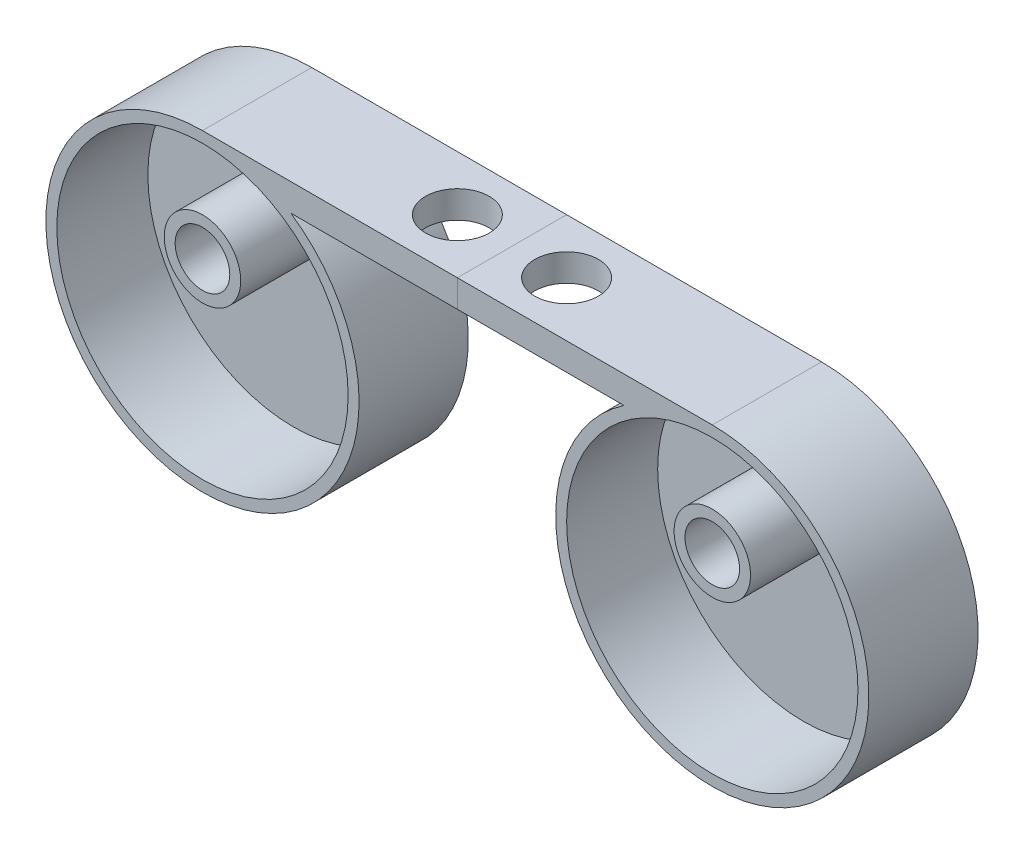
ISO-10303-21;
HEADER;
FILE_DESCRIPTION(('STEP AP214'),'2;1');
FILE_NAME('part.step','',(''),(''),'','','');
FILE_SCHEMA(('AUTOMOTIVE_DESIGN { 1 0 10303 214 1 1 1 1 }'));
ENDSEC;
DATA;
#1=APPLICATION_CONTEXT('core data for automotive mechanical design processes');
#2=APPLICATION_PROTOCOL_DEFINITION('international standard','automotive_design',2000,#1);
#3=PRODUCT_CONTEXT('',#1,'mechanical');
#4=PRODUCT('Part','Part','',(#3));
#5=PRODUCT_RELATED_PRODUCT_CATEGORY('part','',(#4));
#6=PRODUCT_DEFINITION_FORMATION('','',#4);
#7=PRODUCT_DEFINITION_CONTEXT('part definition',#1,'design');
#8=PRODUCT_DEFINITION('design','',#6,#7);
#9=PRODUCT_DEFINITION_SHAPE('','',#8);
#10=(LENGTH_UNIT() NAMED_UNIT(*) SI_UNIT(.MILLI.,.METRE.));
#11=(NAMED_UNIT(*) PLANE_ANGLE_UNIT() SI_UNIT($,.RADIAN.));
#12=(NAMED_UNIT(*) SI_UNIT($,.STERADIAN.) SOLID_ANGLE_UNIT());
#13=UNCERTAINTY_MEASURE_WITH_UNIT(LENGTH_MEASURE(1.E-05),#10,'distance_accuracy_value','');
#14=(GEOMETRIC_REPRESENTATION_CONTEXT(3) GLOBAL_UNCERTAINTY_ASSIGNED_CONTEXT((#13)) GLOBAL_UNIT_ASSIGNED_CONTEXT((#10,
#11,#12)) REPRESENTATION_CONTEXT('',''));
#15=CARTESIAN_POINT('',(0.,0.,0.));
#16=DIRECTION('',(0.,0.,1.));
#17=DIRECTION('',(1.,0.,0.));
#18=AXIS2_PLACEMENT_3D('',#15,#16,#17);
#19=CARTESIAN_POINT('',(56.,0.,2.));
#20=DIRECTION('',(0.,0.,1.));
#21=DIRECTION('',(-1.,0.,0.));
#22=AXIS2_PLACEMENT_3D('',#19,#20,#21);
#23=PLANE('',#22);
#24=CARTESIAN_POINT('',(56.,0.,2.));
#25=DIRECTION('',(0.,0.,-1.));
#26=DIRECTION('',(-1.,0.,0.));
#27=AXIS2_PLACEMENT_3D('',#24,#25,#26);
#28=CIRCLE('',#27,16.);
#29=CARTESIAN_POINT('',(40.,0.,2.));
#30=VERTEX_POINT('',#29);
#31=EDGE_CURVE('E13',#30,#30,#28,.F.);
#32=ORIENTED_EDGE('',*,*,#31,.T.);
#33=EDGE_LOOP('',(#32));
#34=FACE_BOUND('',#33,.T.);
#35=CARTESIAN_POINT('',(56.,5.,2.));
#36=DIRECTION('',(0.,0.,-1.));
#37=DIRECTION('',(-1.,0.,0.));
#38=AXIS2_PLACEMENT_3D('',#35,#36,#37);
#39=CIRCLE('',#38,4.2);
#40=CARTESIAN_POINT('',(51.8,5.,2.));
#41=VERTEX_POINT('',#40);
#42=EDGE_CURVE('E134',#41,#41,#39,.T.);
#43=ORIENTED_EDGE('',*,*,#42,.T.);
#44=EDGE_LOOP('',(#43));
#45=FACE_BOUND('',#44,.T.);
#46=ADVANCED_FACE('F52',(#34,#45),#23,.T.);
#47=CARTESIAN_POINT('',(56.,0.,0.));
#48=DIRECTION('',(0.,0.,1.));
#49=DIRECTION('',(-1.,0.,0.));
#50=AXIS2_PLACEMENT_3D('',#47,#48,#49);
#51=PLANE('',#50);
#52=CARTESIAN_POINT('',(56.,0.,0.));
#53=DIRECTION('',(0.,0.,-1.));
#54=DIRECTION('',(-1.,0.,0.));
#55=AXIS2_PLACEMENT_3D('',#52,#53,#54);
#56=CIRCLE('',#55,17.2);
#57=CARTESIAN_POINT('',(56.,17.2,0.));
#58=VERTEX_POINT('',#57);
#59=CARTESIAN_POINT('',(46.2943315531592,14.2,0.));
#60=VERTEX_POINT('',#59);
#61=EDGE_CURVE('E60',#58,#60,#56,.T.);
#62=ORIENTED_EDGE('',*,*,#61,.T.);
#63=DIRECTION('',(-1.,0.,0.));
#64=VECTOR('',#63,1.);
#65=CARTESIAN_POINT('',(73.201,14.2,0.));
#66=LINE('',#65,#64);
#67=CARTESIAN_POINT('',(28.,14.2,0.));
#68=VERTEX_POINT('',#67);
#69=EDGE_CURVE('E110',#60,#68,#66,.T.);
#70=ORIENTED_EDGE('',*,*,#69,.T.);
#71=DIRECTION('',(0.,1.,0.));
#72=VECTOR('',#71,1.);
#73=CARTESIAN_POINT('',(28.,17.2,0.));
#74=LINE('',#73,#72);
#75=CARTESIAN_POINT('',(28.,17.2,0.));
#76=VERTEX_POINT('',#75);
#77=EDGE_CURVE('E99',#68,#76,#74,.T.);
#78=ORIENTED_EDGE('',*,*,#77,.T.);
#79=DIRECTION('',(-1.,0.,0.));
#80=VECTOR('',#79,1.);
#81=CARTESIAN_POINT('',(73.201,17.2,0.));
#82=LINE('',#81,#80);
#83=EDGE_CURVE('E125',#58,#76,#82,.T.);
#84=ORIENTED_EDGE('',*,*,#83,.F.);
#85=EDGE_LOOP('',(#62,#70,#78,#84));
#86=FACE_BOUND('',#85,.T.);
#87=CARTESIAN_POINT('',(56.,5.,0.));
#88=DIRECTION('',(0.,0.,-1.));
#89=DIRECTION('',(-1.,0.,0.));
#90=AXIS2_PLACEMENT_3D('',#87,#88,#89);
#91=CIRCLE('',#90,3.);
#92=CARTESIAN_POINT('',(53.,5.,0.));
#93=VERTEX_POINT('',#92);
#94=EDGE_CURVE('E141',#93,#93,#91,.T.);
#95=ORIENTED_EDGE('',*,*,#94,.F.);
#96=EDGE_LOOP('',(#95));
#97=FACE_BOUND('',#96,.T.);
#98=ADVANCED_FACE('F148',(#86,#97),#51,.F.);
#99=CARTESIAN_POINT('',(56.,0.,2.));
#100=DIRECTION('',(0.,0.,-1.));
#101=DIRECTION('',(1.,0.,0.));
#102=AXIS2_PLACEMENT_3D('',#99,#100,#101);
#103=CYLINDRICAL_SURFACE('',#102,17.2);
#104=ORIENTED_EDGE('',*,*,#61,.F.);
#105=DIRECTION('',(0.,0.,-1.));
#106=VECTOR('',#105,1.);
#107=CARTESIAN_POINT('',(56.,17.2,2.));
#108=LINE('',#107,#106);
#109=CARTESIAN_POINT('',(56.,17.2,12.));
#110=VERTEX_POINT('',#109);
#111=EDGE_CURVE('E72',#58,#110,#108,.F.);
#112=ORIENTED_EDGE('',*,*,#111,.T.);
#113=CARTESIAN_POINT('',(56.,0.,12.));
#114=DIRECTION('',(0.,0.,-1.));
#115=DIRECTION('',(-1.,0.,0.));
#116=AXIS2_PLACEMENT_3D('',#113,#114,#115);
#117=CIRCLE('',#116,17.2);
#118=CARTESIAN_POINT('',(46.2943315531593,14.2,12.));
#119=VERTEX_POINT('',#118);
#120=EDGE_CURVE('E132',#110,#119,#117,.T.);
#121=ORIENTED_EDGE('',*,*,#120,.T.);
#122=DIRECTION('',(0.,0.,-1.));
#123=VECTOR('',#122,1.);
#124=CARTESIAN_POINT('',(46.2943315531593,14.2,2.));
#125=LINE('',#124,#123);
#126=EDGE_CURVE('E107',#119,#60,#125,.T.);
#127=ORIENTED_EDGE('',*,*,#126,.T.);
#128=EDGE_LOOP('',(#104,#112,#121,#127));
#129=FACE_BOUND('',#128,.T.);
#130=ADVANCED_FACE('F54',(#129),#103,.T.);
#131=CARTESIAN_POINT('',(56.,5.,2.));
#132=DIRECTION('',(0.,0.,-1.));
#133=DIRECTION('',(1.,0.,0.));
#134=AXIS2_PLACEMENT_3D('',#131,#132,#133);
#135=CYLINDRICAL_SURFACE('',#134,3.);
#136=ORIENTED_EDGE('',*,*,#94,.T.);
#137=EDGE_LOOP('',(#136));
#138=FACE_BOUND('',#137,.T.);
#139=CARTESIAN_POINT('',(56.,5.,12.));
#140=DIRECTION('',(0.,0.,-1.));
#141=DIRECTION('',(-1.,0.,0.));
#142=AXIS2_PLACEMENT_3D('',#139,#140,#141);
#143=CIRCLE('',#142,3.);
#144=CARTESIAN_POINT('',(53.,5.,12.));
#145=VERTEX_POINT('',#144);
#146=EDGE_CURVE('E135',#145,#145,#143,.F.);
#147=ORIENTED_EDGE('',*,*,#146,.T.);
#148=EDGE_LOOP('',(#147));
#149=FACE_BOUND('',#148,.T.);
#150=ADVANCED_FACE('F152',(#138,#149),#135,.F.);
#151=CARTESIAN_POINT('',(56.,5.,12.));
#152=DIRECTION('',(0.,0.,-1.));
#153=DIRECTION('',(1.,0.,0.));
#154=AXIS2_PLACEMENT_3D('',#151,#152,#153);
#155=CYLINDRICAL_SURFACE('',#154,4.2);
#156=CARTESIAN_POINT('',(56.,5.,12.));
#157=DIRECTION('',(0.,0.,-1.));
#158=DIRECTION('',(-1.,0.,0.));
#159=AXIS2_PLACEMENT_3D('',#156,#157,#158);
#160=CIRCLE('',#159,4.2);
#161=CARTESIAN_POINT('',(51.8,5.,12.));
#162=VERTEX_POINT('',#161);
#163=EDGE_CURVE('E138',#162,#162,#160,.T.);
#164=ORIENTED_EDGE('',*,*,#163,.T.);
#165=EDGE_LOOP('',(#164));
#166=FACE_BOUND('',#165,.T.);
#167=ORIENTED_EDGE('',*,*,#42,.F.);
#168=EDGE_LOOP('',(#167));
#169=FACE_BOUND('',#168,.T.);
#170=ADVANCED_FACE('F157',(#166,#169),#155,.T.);
#171=CARTESIAN_POINT('',(56.,0.,12.));
#172=DIRECTION('',(0.,0.,1.));
#173=DIRECTION('',(-1.,0.,0.));
#174=AXIS2_PLACEMENT_3D('',#171,#172,#173);
#175=PLANE('',#174);
#176=ORIENTED_EDGE('',*,*,#146,.F.);
#177=EDGE_LOOP('',(#176));
#178=FACE_BOUND('',#177,.T.);
#179=ORIENTED_EDGE('',*,*,#163,.F.);
#180=EDGE_LOOP('',(#179));
#181=FACE_BOUND('',#180,.T.);
#182=ADVANCED_FACE('F169',(#178,#181),#175,.T.);
#183=CARTESIAN_POINT('',(56.,0.,12.));
#184=DIRECTION('',(0.,0.,-1.));
#185=DIRECTION('',(1.,0.,0.));
#186=AXIS2_PLACEMENT_3D('',#183,#184,#185);
#187=CYLINDRICAL_SURFACE('',#186,16.);
#188=CARTESIAN_POINT('',(56.,0.,12.));
#189=DIRECTION('',(0.,0.,-1.));
#190=DIRECTION('',(-1.,0.,0.));
#191=AXIS2_PLACEMENT_3D('',#188,#189,#190);
#192=CIRCLE('',#191,16.);
#193=CARTESIAN_POINT('',(40.,0.,12.));
#194=VERTEX_POINT('',#193);
#195=EDGE_CURVE('E129',#194,#194,#192,.T.);
#196=ORIENTED_EDGE('',*,*,#195,.F.);
#197=EDGE_LOOP('',(#196));
#198=FACE_BOUND('',#197,.T.);
#199=ORIENTED_EDGE('',*,*,#31,.F.);
#200=EDGE_LOOP('',(#199));
#201=FACE_BOUND('',#200,.T.);
#202=ADVANCED_FACE('F173',(#198,#201),#187,.F.);
#203=CARTESIAN_POINT('',(56.,0.,12.));
#204=DIRECTION('',(0.,0.,1.));
#205=DIRECTION('',(-1.,0.,0.));
#206=AXIS2_PLACEMENT_3D('',#203,#204,#205);
#207=PLANE('',#206);
#208=ORIENTED_EDGE('',*,*,#195,.T.);
#209=EDGE_LOOP('',(#208));
#210=FACE_BOUND('',#209,.T.);
#211=ORIENTED_EDGE('',*,*,#120,.F.);
#212=DIRECTION('',(-1.,0.,0.));
#213=VECTOR('',#212,1.);
#214=CARTESIAN_POINT('',(73.201,17.2,12.));
#215=LINE('',#214,#213);
#216=CARTESIAN_POINT('',(28.,17.2,12.));
#217=VERTEX_POINT('',#216);
#218=EDGE_CURVE('E67',#110,#217,#215,.T.);
#219=ORIENTED_EDGE('',*,*,#218,.T.);
#220=DIRECTION('',(0.,-1.,0.));
#221=VECTOR('',#220,1.);
#222=CARTESIAN_POINT('',(28.,17.2,12.));
#223=LINE('',#222,#221);
#224=CARTESIAN_POINT('',(28.,14.2,12.));
#225=VERTEX_POINT('',#224);
#226=EDGE_CURVE('E97',#217,#225,#223,.T.);
#227=ORIENTED_EDGE('',*,*,#226,.T.);
#228=DIRECTION('',(-1.,0.,0.));
#229=VECTOR('',#228,1.);
#230=CARTESIAN_POINT('',(73.201,14.2,12.));
#231=LINE('',#230,#229);
#232=EDGE_CURVE('E105',#119,#225,#231,.T.);
#233=ORIENTED_EDGE('',*,*,#232,.F.);
#234=EDGE_LOOP('',(#211,#219,#227,#233));
#235=FACE_BOUND('',#234,.T.);
#236=ADVANCED_FACE('F113',(#210,#235),#207,.T.);
#237=CARTESIAN_POINT('',(28.,0.,0.));
#238=DIRECTION('',(-1.,0.,0.));
#239=DIRECTION('',(0.,0.,-1.));
#240=AXIS2_PLACEMENT_3D('',#237,#238,#239);
#241=PLANE('',#240);
#242=ORIENTED_EDGE('',*,*,#226,.F.);
#243=DIRECTION('',(0.,0.,1.));
#244=VECTOR('',#243,1.);
#245=CARTESIAN_POINT('',(28.,17.2,12.));
#246=LINE('',#245,#244);
#247=EDGE_CURVE('E111',#76,#217,#246,.T.);
#248=ORIENTED_EDGE('',*,*,#247,.F.);
#249=ORIENTED_EDGE('',*,*,#77,.F.);
#250=DIRECTION('',(0.,0.,-1.));
#251=VECTOR('',#250,1.);
#252=CARTESIAN_POINT('',(28.,14.2,12.));
#253=LINE('',#252,#251);
#254=EDGE_CURVE('E93',#225,#68,#253,.T.);
#255=ORIENTED_EDGE('',*,*,#254,.F.);
#256=EDGE_LOOP('',(#242,#248,#249,#255));
#257=FACE_BOUND('',#256,.T.);
#258=ADVANCED_FACE('F95',(#257),#241,.T.);
#259=CARTESIAN_POINT('',(73.201,14.2,12.));
#260=DIRECTION('',(0.,-1.,0.));
#261=DIRECTION('',(0.,0.,-1.));
#262=AXIS2_PLACEMENT_3D('',#259,#260,#261);
#263=PLANE('',#262);
#264=CARTESIAN_POINT('',(34.,14.2,6.));
#265=DIRECTION('',(0.,1.,0.));
#266=DIRECTION('',(0.,0.,-1.));
#267=AXIS2_PLACEMENT_3D('',#264,#265,#266);
#268=CIRCLE('',#267,3.49787974336991);
#269=CARTESIAN_POINT('',(34.,14.2,2.50212025663009));
#270=VERTEX_POINT('',#269);
#271=EDGE_CURVE('E117',#270,#270,#268,.F.);
#272=ORIENTED_EDGE('',*,*,#271,.F.);
#273=EDGE_LOOP('',(#272));
#274=FACE_BOUND('',#273,.T.);
#275=ORIENTED_EDGE('',*,*,#232,.T.);
#276=ORIENTED_EDGE('',*,*,#254,.T.);
#277=ORIENTED_EDGE('',*,*,#69,.F.);
#278=ORIENTED_EDGE('',*,*,#126,.F.);
#279=EDGE_LOOP('',(#275,#276,#277,#278));
#280=FACE_BOUND('',#279,.T.);
#281=ADVANCED_FACE('F106',(#274,#280),#263,.T.);
#282=CARTESIAN_POINT('',(73.201,17.2,12.));
#283=DIRECTION('',(0.,1.,0.));
#284=DIRECTION('',(0.,0.,1.));
#285=AXIS2_PLACEMENT_3D('',#282,#283,#284);
#286=PLANE('',#285);
#287=CARTESIAN_POINT('',(34.,17.2,6.));
#288=DIRECTION('',(0.,-1.,0.));
#289=DIRECTION('',(0.,0.,1.));
#290=AXIS2_PLACEMENT_3D('',#287,#288,#289);
#291=CIRCLE('',#290,3.49787974336991);
#292=CARTESIAN_POINT('',(34.,17.2,9.49787974336991));
#293=VERTEX_POINT('',#292);
#294=EDGE_CURVE('E114',#293,#293,#291,.T.);
#295=ORIENTED_EDGE('',*,*,#294,.T.);
#296=EDGE_LOOP('',(#295));
#297=FACE_BOUND('',#296,.T.);
#298=ORIENTED_EDGE('',*,*,#83,.T.);
#299=ORIENTED_EDGE('',*,*,#247,.T.);
#300=ORIENTED_EDGE('',*,*,#218,.F.);
#301=ORIENTED_EDGE('',*,*,#111,.F.);
#302=EDGE_LOOP('',(#298,#299,#300,#301));
#303=FACE_BOUND('',#302,.T.);
#304=ADVANCED_FACE('F183',(#297,#303),#286,.T.);
#305=CARTESIAN_POINT('',(34.,-17.201,6.));
#306=DIRECTION('',(0.,1.,0.));
#307=DIRECTION('',(0.,0.,1.));
#308=AXIS2_PLACEMENT_3D('',#305,#306,#307);
#309=CYLINDRICAL_SURFACE('',#308,3.49787974336991);
#310=ORIENTED_EDGE('',*,*,#271,.T.);
#311=EDGE_LOOP('',(#310));
#312=FACE_BOUND('',#311,.T.);
#313=ORIENTED_EDGE('',*,*,#294,.F.);
#314=EDGE_LOOP('',(#313));
#315=FACE_BOUND('',#314,.T.);
#316=ADVANCED_FACE('F187',(#312,#315),#309,.F.);
#317=CLOSED_SHELL('',(#46,#98,#130,#150,#170,#182,#202,#236,#258,#281,#304,#316));
#318=MANIFOLD_SOLID_BREP('B2_NOT_SHOWN',#317);
#319=CARTESIAN_POINT('',(0.,0.,2.));
#320=DIRECTION('',(0.,0.,1.));
#321=DIRECTION('',(1.,0.,0.));
#322=AXIS2_PLACEMENT_3D('',#319,#320,#321);
#323=PLANE('',#322);
#324=CARTESIAN_POINT('',(0.,0.,2.));
#325=DIRECTION('',(0.,0.,1.));
#326=DIRECTION('',(1.,0.,0.));
#327=AXIS2_PLACEMENT_3D('',#324,#325,#326);
#328=CIRCLE('',#327,16.);
#329=CARTESIAN_POINT('',(16.,0.,2.));
#330=VERTEX_POINT('',#329);
#331=EDGE_CURVE('E50',#330,#330,#328,.F.);
#332=ORIENTED_EDGE('',*,*,#331,.F.);
#333=EDGE_LOOP('',(#332));
#334=FACE_BOUND('',#333,.T.);
#335=CARTESIAN_POINT('',(0.,5.,2.));
#336=DIRECTION('',(0.,0.,1.));
#337=DIRECTION('',(1.,0.,0.));
#338=AXIS2_PLACEMENT_3D('',#335,#336,#337);
#339=CIRCLE('',#338,4.2);
#340=CARTESIAN_POINT('',(4.2,5.,2.));
#341=VERTEX_POINT('',#340);
#342=EDGE_CURVE('E414',#341,#341,#339,.T.);
#343=ORIENTED_EDGE('',*,*,#342,.F.);
#344=EDGE_LOOP('',(#343));
#345=FACE_BOUND('',#344,.T.);
#346=ADVANCED_FACE('F332',(#334,#345),#323,.T.);
#347=CARTESIAN_POINT('',(0.,0.,0.));
#348=DIRECTION('',(0.,0.,1.));
#349=DIRECTION('',(1.,0.,0.));
#350=AXIS2_PLACEMENT_3D('',#347,#348,#349);
#351=PLANE('',#350);
#352=CARTESIAN_POINT('',(0.,0.,0.));
#353=DIRECTION('',(0.,0.,1.));
#354=DIRECTION('',(1.,0.,0.));
#355=AXIS2_PLACEMENT_3D('',#352,#353,#354);
#356=CIRCLE('',#355,17.2);
#357=CARTESIAN_POINT('',(0.,17.2,0.));
#358=VERTEX_POINT('',#357);
#359=CARTESIAN_POINT('',(9.70566844684075,14.2,0.));
#360=VERTEX_POINT('',#359);
#361=EDGE_CURVE('E340',#358,#360,#356,.T.);
#362=ORIENTED_EDGE('',*,*,#361,.F.);
#363=DIRECTION('',(1.,0.,0.));
#364=VECTOR('',#363,1.);
#365=CARTESIAN_POINT('',(-17.201,17.2,0.));
#366=LINE('',#365,#364);
#367=CARTESIAN_POINT('',(28.,17.2,0.));
#368=VERTEX_POINT('',#367);
#369=EDGE_CURVE('E352',#358,#368,#366,.T.);
#370=ORIENTED_EDGE('',*,*,#369,.T.);
#371=DIRECTION('',(0.,1.,0.));
#372=VECTOR('',#371,1.);
#373=CARTESIAN_POINT('',(28.,17.2,0.));
#374=LINE('',#373,#372);
#375=CARTESIAN_POINT('',(28.,14.2,0.));
#376=VERTEX_POINT('',#375);
#377=EDGE_CURVE('E391',#376,#368,#374,.T.);
#378=ORIENTED_EDGE('',*,*,#377,.F.);
#379=DIRECTION('',(1.,0.,0.));
#380=VECTOR('',#379,1.);
#381=CARTESIAN_POINT('',(-17.201,14.2,0.));
#382=LINE('',#381,#380);
#383=EDGE_CURVE('E382',#360,#376,#382,.T.);
#384=ORIENTED_EDGE('',*,*,#383,.F.);
#385=EDGE_LOOP('',(#362,#370,#378,#384));
#386=FACE_BOUND('',#385,.T.);
#387=CARTESIAN_POINT('',(0.,5.,0.));
#388=DIRECTION('',(0.,0.,1.));
#389=DIRECTION('',(1.,0.,0.));
#390=AXIS2_PLACEMENT_3D('',#387,#388,#389);
#391=CIRCLE('',#390,3.);
#392=CARTESIAN_POINT('',(3.,5.,0.));
#393=VERTEX_POINT('',#392);
#394=EDGE_CURVE('E421',#393,#393,#391,.T.);
#395=ORIENTED_EDGE('',*,*,#394,.T.);
#396=EDGE_LOOP('',(#395));
#397=FACE_BOUND('',#396,.T.);
#398=ADVANCED_FACE('F429',(#386,#397),#351,.F.);
#399=CARTESIAN_POINT('',(0.,0.,2.));
#400=DIRECTION('',(0.,0.,-1.));
#401=DIRECTION('',(-1.,0.,0.));
#402=AXIS2_PLACEMENT_3D('',#399,#400,#401);
#403=CYLINDRICAL_SURFACE('',#402,17.2);
#404=ORIENTED_EDGE('',*,*,#361,.T.);
#405=DIRECTION('',(0.,0.,-1.));
#406=VECTOR('',#405,1.);
#407=CARTESIAN_POINT('',(9.70566844684075,14.2,2.));
#408=LINE('',#407,#406);
#409=CARTESIAN_POINT('',(9.70566844684075,14.2,12.));
#410=VERTEX_POINT('',#409);
#411=EDGE_CURVE('E406',#410,#360,#408,.T.);
#412=ORIENTED_EDGE('',*,*,#411,.F.);
#413=CARTESIAN_POINT('',(0.,0.,12.));
#414=DIRECTION('',(0.,0.,1.));
#415=DIRECTION('',(1.,0.,0.));
#416=AXIS2_PLACEMENT_3D('',#413,#414,#415);
#417=CIRCLE('',#416,17.2);
#418=CARTESIAN_POINT('',(0.,17.2,12.));
#419=VERTEX_POINT('',#418);
#420=EDGE_CURVE('E378',#419,#410,#417,.T.);
#421=ORIENTED_EDGE('',*,*,#420,.F.);
#422=DIRECTION('',(0.,0.,-1.));
#423=VECTOR('',#422,1.);
#424=CARTESIAN_POINT('',(0.,17.2,2.));
#425=LINE('',#424,#423);
#426=EDGE_CURVE('E347',#358,#419,#425,.F.);
#427=ORIENTED_EDGE('',*,*,#426,.F.);
#428=EDGE_LOOP('',(#404,#412,#421,#427));
#429=FACE_BOUND('',#428,.T.);
#430=ADVANCED_FACE('F334',(#429),#403,.T.);
#431=CARTESIAN_POINT('',(0.,5.,2.));
#432=DIRECTION('',(0.,0.,-1.));
#433=DIRECTION('',(-1.,0.,0.));
#434=AXIS2_PLACEMENT_3D('',#431,#432,#433);
#435=CYLINDRICAL_SURFACE('',#434,3.);
#436=ORIENTED_EDGE('',*,*,#394,.F.);
#437=EDGE_LOOP('',(#436));
#438=FACE_BOUND('',#437,.T.);
#439=CARTESIAN_POINT('',(0.,5.,12.));
#440=DIRECTION('',(0.,0.,1.));
#441=DIRECTION('',(1.,0.,0.));
#442=AXIS2_PLACEMENT_3D('',#439,#440,#441);
#443=CIRCLE('',#442,3.);
#444=CARTESIAN_POINT('',(3.,5.,12.));
#445=VERTEX_POINT('',#444);
#446=EDGE_CURVE('E415',#445,#445,#443,.F.);
#447=ORIENTED_EDGE('',*,*,#446,.F.);
#448=EDGE_LOOP('',(#447));
#449=FACE_BOUND('',#448,.T.);
#450=ADVANCED_FACE('F455',(#438,#449),#435,.F.);
#451=CARTESIAN_POINT('',(0.,5.,12.));
#452=DIRECTION('',(0.,0.,-1.));
#453=DIRECTION('',(-1.,0.,0.));
#454=AXIS2_PLACEMENT_3D('',#451,#452,#453);
#455=CYLINDRICAL_SURFACE('',#454,4.2);
#456=CARTESIAN_POINT('',(0.,5.,12.));
#457=DIRECTION('',(0.,0.,1.));
#458=DIRECTION('',(1.,0.,0.));
#459=AXIS2_PLACEMENT_3D('',#456,#457,#458);
#460=CIRCLE('',#459,4.2);
#461=CARTESIAN_POINT('',(4.2,5.,12.));
#462=VERTEX_POINT('',#461);
#463=EDGE_CURVE('E418',#462,#462,#460,.T.);
#464=ORIENTED_EDGE('',*,*,#463,.F.);
#465=EDGE_LOOP('',(#464));
#466=FACE_BOUND('',#465,.T.);
#467=ORIENTED_EDGE('',*,*,#342,.T.);
#468=EDGE_LOOP('',(#467));
#469=FACE_BOUND('',#468,.T.);
#470=ADVANCED_FACE('F458',(#466,#469),#455,.T.);
#471=CARTESIAN_POINT('',(0.,0.,12.));
#472=DIRECTION('',(0.,0.,1.));
#473=DIRECTION('',(1.,0.,0.));
#474=AXIS2_PLACEMENT_3D('',#471,#472,#473);
#475=PLANE('',#474);
#476=ORIENTED_EDGE('',*,*,#446,.T.);
#477=EDGE_LOOP('',(#476));
#478=FACE_BOUND('',#477,.T.);
#479=ORIENTED_EDGE('',*,*,#463,.T.);
#480=EDGE_LOOP('',(#479));
#481=FACE_BOUND('',#480,.T.);
#482=ADVANCED_FACE('F462',(#478,#481),#475,.T.);
#483=CARTESIAN_POINT('',(0.,0.,12.));
#484=DIRECTION('',(0.,0.,-1.));
#485=DIRECTION('',(-1.,0.,0.));
#486=AXIS2_PLACEMENT_3D('',#483,#484,#485);
#487=CYLINDRICAL_SURFACE('',#486,16.);
#488=CARTESIAN_POINT('',(0.,0.,12.));
#489=DIRECTION('',(0.,0.,1.));
#490=DIRECTION('',(1.,0.,0.));
#491=AXIS2_PLACEMENT_3D('',#488,#489,#490);
#492=CIRCLE('',#491,16.);
#493=CARTESIAN_POINT('',(16.,0.,12.));
#494=VERTEX_POINT('',#493);
#495=EDGE_CURVE('E410',#494,#494,#492,.T.);
#496=ORIENTED_EDGE('',*,*,#495,.T.);
#497=EDGE_LOOP('',(#496));
#498=FACE_BOUND('',#497,.T.);
#499=ORIENTED_EDGE('',*,*,#331,.T.);
#500=EDGE_LOOP('',(#499));
#501=FACE_BOUND('',#500,.T.);
#502=ADVANCED_FACE('F466',(#498,#501),#487,.F.);
#503=CARTESIAN_POINT('',(0.,0.,12.));
#504=DIRECTION('',(0.,0.,1.));
#505=DIRECTION('',(1.,0.,0.));
#506=AXIS2_PLACEMENT_3D('',#503,#504,#505);
#507=PLANE('',#506);
#508=ORIENTED_EDGE('',*,*,#495,.F.);
#509=EDGE_LOOP('',(#508));
#510=FACE_BOUND('',#509,.T.);
#511=ORIENTED_EDGE('',*,*,#420,.T.);
#512=DIRECTION('',(1.,0.,0.));
#513=VECTOR('',#512,1.);
#514=CARTESIAN_POINT('',(-17.201,14.2,12.));
#515=LINE('',#514,#513);
#516=CARTESIAN_POINT('',(28.,14.2,12.));
#517=VERTEX_POINT('',#516);
#518=EDGE_CURVE('E371',#410,#517,#515,.T.);
#519=ORIENTED_EDGE('',*,*,#518,.T.);
#520=DIRECTION('',(0.,-1.,0.));
#521=VECTOR('',#520,1.);
#522=CARTESIAN_POINT('',(28.,17.2,12.));
#523=LINE('',#522,#521);
#524=CARTESIAN_POINT('',(28.,17.2,12.));
#525=VERTEX_POINT('',#524);
#526=EDGE_CURVE('E375',#525,#517,#523,.T.);
#527=ORIENTED_EDGE('',*,*,#526,.F.);
#528=DIRECTION('',(1.,0.,0.));
#529=VECTOR('',#528,1.);
#530=CARTESIAN_POINT('',(-17.201,17.2,12.));
#531=LINE('',#530,#529);
#532=EDGE_CURVE('E404',#419,#525,#531,.T.);
#533=ORIENTED_EDGE('',*,*,#532,.F.);
#534=EDGE_LOOP('',(#511,#519,#527,#533));
#535=FACE_BOUND('',#534,.T.);
#536=ADVANCED_FACE('F373',(#510,#535),#507,.T.);
#537=CARTESIAN_POINT('',(28.,0.,0.));
#538=DIRECTION('',(1.,0.,0.));
#539=DIRECTION('',(0.,0.,-1.));
#540=AXIS2_PLACEMENT_3D('',#537,#538,#539);
#541=PLANE('',#540);
#542=ORIENTED_EDGE('',*,*,#526,.T.);
#543=DIRECTION('',(0.,0.,-1.));
#544=VECTOR('',#543,1.);
#545=CARTESIAN_POINT('',(28.,14.2,12.));
#546=LINE('',#545,#544);
#547=EDGE_CURVE('E386',#517,#376,#546,.T.);
#548=ORIENTED_EDGE('',*,*,#547,.T.);
#549=ORIENTED_EDGE('',*,*,#377,.T.);
#550=DIRECTION('',(0.,0.,1.));
#551=VECTOR('',#550,1.);
#552=CARTESIAN_POINT('',(28.,17.2,12.));
#553=LINE('',#552,#551);
#554=EDGE_CURVE('E383',#368,#525,#553,.T.);
#555=ORIENTED_EDGE('',*,*,#554,.T.);
#556=EDGE_LOOP('',(#542,#548,#549,#555));
#557=FACE_BOUND('',#556,.T.);
#558=ADVANCED_FACE('F393',(#557),#541,.T.);
#559=CARTESIAN_POINT('',(-17.201,14.2,12.));
#560=DIRECTION('',(0.,-1.,0.));
#561=DIRECTION('',(0.,0.,-1.));
#562=AXIS2_PLACEMENT_3D('',#559,#560,#561);
#563=PLANE('',#562);
#564=CARTESIAN_POINT('',(22.,14.2,6.));
#565=DIRECTION('',(0.,-1.,0.));
#566=DIRECTION('',(0.,0.,-1.));
#567=AXIS2_PLACEMENT_3D('',#564,#565,#566);
#568=CIRCLE('',#567,3.49787974336991);
#569=CARTESIAN_POINT('',(22.,14.2,2.50212025663009));
#570=VERTEX_POINT('',#569);
#571=EDGE_CURVE('E397',#570,#570,#568,.F.);
#572=ORIENTED_EDGE('',*,*,#571,.T.);
#573=EDGE_LOOP('',(#572));
#574=FACE_BOUND('',#573,.T.);
#575=ORIENTED_EDGE('',*,*,#518,.F.);
#576=ORIENTED_EDGE('',*,*,#411,.T.);
#577=ORIENTED_EDGE('',*,*,#383,.T.);
#578=ORIENTED_EDGE('',*,*,#547,.F.);
#579=EDGE_LOOP('',(#575,#576,#577,#578));
#580=FACE_BOUND('',#579,.T.);
#581=ADVANCED_FACE('F387',(#574,#580),#563,.T.);
#582=CARTESIAN_POINT('',(-17.201,17.2,12.));
#583=DIRECTION('',(0.,1.,0.));
#584=DIRECTION('',(0.,0.,1.));
#585=AXIS2_PLACEMENT_3D('',#582,#583,#584);
#586=PLANE('',#585);
#587=CARTESIAN_POINT('',(22.,17.2,6.));
#588=DIRECTION('',(0.,1.,0.));
#589=DIRECTION('',(0.,0.,1.));
#590=AXIS2_PLACEMENT_3D('',#587,#588,#589);
#591=CIRCLE('',#590,3.49787974336991);
#592=CARTESIAN_POINT('',(22.,17.2,9.49787974336991));
#593=VERTEX_POINT('',#592);
#594=EDGE_CURVE('E394',#593,#593,#591,.T.);
#595=ORIENTED_EDGE('',*,*,#594,.F.);
#596=EDGE_LOOP('',(#595));
#597=FACE_BOUND('',#596,.T.);
#598=ORIENTED_EDGE('',*,*,#369,.F.);
#599=ORIENTED_EDGE('',*,*,#426,.T.);
#600=ORIENTED_EDGE('',*,*,#532,.T.);
#601=ORIENTED_EDGE('',*,*,#554,.F.);
#602=EDGE_LOOP('',(#598,#599,#600,#601));
#603=FACE_BOUND('',#602,.T.);
#604=ADVANCED_FACE('F431',(#597,#603),#586,.T.);
#605=CARTESIAN_POINT('',(22.,-17.201,6.));
#606=DIRECTION('',(0.,1.,0.));
#607=DIRECTION('',(0.,0.,1.));
#608=AXIS2_PLACEMENT_3D('',#605,#606,#607);
#609=CYLINDRICAL_SURFACE('',#608,3.49787974336991);
#610=ORIENTED_EDGE('',*,*,#571,.F.);
#611=EDGE_LOOP('',(#610));
#612=FACE_BOUND('',#611,.T.);
#613=ORIENTED_EDGE('',*,*,#594,.T.);
#614=EDGE_LOOP('',(#613));
#615=FACE_BOUND('',#614,.T.);
#616=ADVANCED_FACE('F433',(#612,#615),#609,.F.);
#617=CLOSED_SHELL('',(#346,#398,#430,#450,#470,#482,#502,#536,#558,#581,#604,#616));
#618=MANIFOLD_SOLID_BREP('B7',#617);
#619=ADVANCED_BREP_SHAPE_REPRESENTATION('',(#18,#318,#618),#14);
#620=SHAPE_DEFINITION_REPRESENTATION(#9,#619);
ENDSEC;
END-ISO-10303-21;
